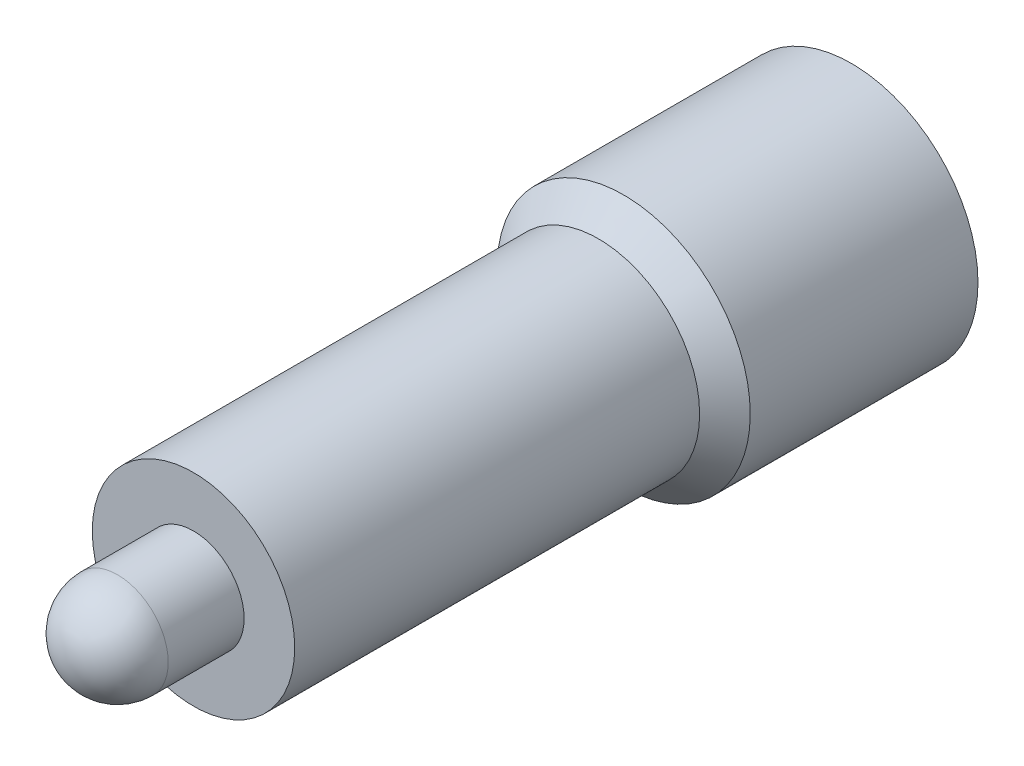
ISO-10303-21;
HEADER;
FILE_DESCRIPTION(('STEP AP214'),'2;1');
FILE_NAME('part.step','',(''),(''),'','','');
FILE_SCHEMA(('AUTOMOTIVE_DESIGN { 1 0 10303 214 1 1 1 1 }'));
ENDSEC;
DATA;
#1=APPLICATION_CONTEXT('core data for automotive mechanical design processes');
#2=APPLICATION_PROTOCOL_DEFINITION('international standard','automotive_design',2000,#1);
#3=PRODUCT_CONTEXT('',#1,'mechanical');
#4=PRODUCT('Part','Part','',(#3));
#5=PRODUCT_RELATED_PRODUCT_CATEGORY('part','',(#4));
#6=PRODUCT_DEFINITION_FORMATION('','',#4);
#7=PRODUCT_DEFINITION_CONTEXT('part definition',#1,'design');
#8=PRODUCT_DEFINITION('design','',#6,#7);
#9=PRODUCT_DEFINITION_SHAPE('','',#8);
#10=(LENGTH_UNIT() NAMED_UNIT(*) SI_UNIT(.MILLI.,.METRE.));
#11=(NAMED_UNIT(*) PLANE_ANGLE_UNIT() SI_UNIT($,.RADIAN.));
#12=(NAMED_UNIT(*) SI_UNIT($,.STERADIAN.) SOLID_ANGLE_UNIT());
#13=UNCERTAINTY_MEASURE_WITH_UNIT(LENGTH_MEASURE(1.E-05),#10,'distance_accuracy_value','');
#14=(GEOMETRIC_REPRESENTATION_CONTEXT(3) GLOBAL_UNCERTAINTY_ASSIGNED_CONTEXT((#13)) GLOBAL_UNIT_ASSIGNED_CONTEXT((#10,
#11,#12)) REPRESENTATION_CONTEXT('',''));
#15=CARTESIAN_POINT('',(0.,0.,0.));
#16=DIRECTION('',(0.,0.,1.));
#17=DIRECTION('',(1.,0.,0.));
#18=AXIS2_PLACEMENT_3D('',#15,#16,#17);
#19=CARTESIAN_POINT('',(0.,0.,10.));
#20=DIRECTION('',(0.,0.,-1.));
#21=DIRECTION('',(-1.,0.,0.));
#22=AXIS2_PLACEMENT_3D('',#19,#20,#21);
#23=CYLINDRICAL_SURFACE('',#22,5.);
#24=CARTESIAN_POINT('',(0.,0.,9.));
#25=DIRECTION('',(0.,0.,1.));
#26=DIRECTION('',(1.,0.,0.));
#27=AXIS2_PLACEMENT_3D('',#24,#25,#26);
#28=CIRCLE('',#27,5.);
#29=CARTESIAN_POINT('',(5.,0.,9.));
#30=VERTEX_POINT('',#29);
#31=EDGE_CURVE('E58',#30,#30,#28,.F.);
#32=ORIENTED_EDGE('',*,*,#31,.T.);
#33=EDGE_LOOP('',(#32));
#34=FACE_BOUND('',#33,.T.);
#35=CARTESIAN_POINT('',(0.,0.,0.));
#36=DIRECTION('',(0.,0.,1.));
#37=DIRECTION('',(1.,0.,0.));
#38=AXIS2_PLACEMENT_3D('',#35,#36,#37);
#39=CIRCLE('',#38,5.);
#40=CARTESIAN_POINT('',(5.,0.,0.));
#41=VERTEX_POINT('',#40);
#42=EDGE_CURVE('E70',#41,#41,#39,.T.);
#43=ORIENTED_EDGE('',*,*,#42,.T.);
#44=EDGE_LOOP('',(#43));
#45=FACE_BOUND('',#44,.T.);
#46=ADVANCED_FACE('F45',(#34,#45),#23,.T.);
#47=CARTESIAN_POINT('',(0.,0.,0.));
#48=DIRECTION('',(0.,0.,1.));
#49=DIRECTION('',(1.,0.,0.));
#50=AXIS2_PLACEMENT_3D('',#47,#48,#49);
#51=PLANE('',#50);
#52=ORIENTED_EDGE('',*,*,#42,.F.);
#53=EDGE_LOOP('',(#52));
#54=FACE_BOUND('',#53,.T.);
#55=ADVANCED_FACE('F82',(#54),#51,.F.);
#56=CARTESIAN_POINT('',(0.,0.,10.));
#57=DIRECTION('',(0.,0.,-1.));
#58=DIRECTION('',(-1.,0.,0.));
#59=AXIS2_PLACEMENT_3D('',#56,#57,#58);
#60=CONICAL_SURFACE('',#59,4.,0.785398163397449);
#61=ORIENTED_EDGE('',*,*,#31,.F.);
#62=EDGE_LOOP('',(#61));
#63=FACE_BOUND('',#62,.T.);
#64=CARTESIAN_POINT('',(0.,0.,10.));
#65=DIRECTION('',(0.,0.,1.));
#66=DIRECTION('',(1.,0.,0.));
#67=AXIS2_PLACEMENT_3D('',#64,#65,#66);
#68=CIRCLE('',#67,4.);
#69=CARTESIAN_POINT('',(4.,0.,10.));
#70=VERTEX_POINT('',#69);
#71=EDGE_CURVE('E64',#70,#70,#68,.T.);
#72=ORIENTED_EDGE('',*,*,#71,.F.);
#73=EDGE_LOOP('',(#72));
#74=FACE_BOUND('',#73,.T.);
#75=ADVANCED_FACE('F80',(#63,#74),#60,.T.);
#76=CARTESIAN_POINT('',(0.,0.,26.));
#77=DIRECTION('',(0.,0.,-1.));
#78=DIRECTION('',(-1.,0.,0.));
#79=AXIS2_PLACEMENT_3D('',#76,#77,#78);
#80=CYLINDRICAL_SURFACE('',#79,4.);
#81=CARTESIAN_POINT('',(0.,0.,26.));
#82=DIRECTION('',(0.,0.,1.));
#83=DIRECTION('',(1.,0.,0.));
#84=AXIS2_PLACEMENT_3D('',#81,#82,#83);
#85=CIRCLE('',#84,4.);
#86=CARTESIAN_POINT('',(4.,0.,26.));
#87=VERTEX_POINT('',#86);
#88=EDGE_CURVE('E66',#87,#87,#85,.T.);
#89=ORIENTED_EDGE('',*,*,#88,.F.);
#90=EDGE_LOOP('',(#89));
#91=FACE_BOUND('',#90,.T.);
#92=ORIENTED_EDGE('',*,*,#71,.T.);
#93=EDGE_LOOP('',(#92));
#94=FACE_BOUND('',#93,.T.);
#95=ADVANCED_FACE('F78',(#91,#94),#80,.T.);
#96=CARTESIAN_POINT('',(0.,0.,26.));
#97=DIRECTION('',(0.,0.,1.));
#98=DIRECTION('',(1.,0.,0.));
#99=AXIS2_PLACEMENT_3D('',#96,#97,#98);
#100=PLANE('',#99);
#101=CARTESIAN_POINT('',(0.,0.,26.));
#102=DIRECTION('',(0.,0.,1.));
#103=DIRECTION('',(1.,0.,0.));
#104=AXIS2_PLACEMENT_3D('',#101,#102,#103);
#105=CIRCLE('',#104,2.);
#106=CARTESIAN_POINT('',(2.,0.,26.));
#107=VERTEX_POINT('',#106);
#108=EDGE_CURVE('E53',#107,#107,#105,.T.);
#109=ORIENTED_EDGE('',*,*,#108,.F.);
#110=EDGE_LOOP('',(#109));
#111=FACE_BOUND('',#110,.T.);
#112=ORIENTED_EDGE('',*,*,#88,.T.);
#113=EDGE_LOOP('',(#112));
#114=FACE_BOUND('',#113,.T.);
#115=ADVANCED_FACE('F88',(#111,#114),#100,.T.);
#116=CARTESIAN_POINT('',(0.,0.,31.));
#117=DIRECTION('',(0.,0.,-1.));
#118=DIRECTION('',(-1.,0.,0.));
#119=AXIS2_PLACEMENT_3D('',#116,#117,#118);
#120=CYLINDRICAL_SURFACE('',#119,2.);
#121=CARTESIAN_POINT('',(0.,0.,29.));
#122=DIRECTION('',(0.,0.,-1.));
#123=DIRECTION('',(-1.,0.,0.));
#124=AXIS2_PLACEMENT_3D('',#121,#122,#123);
#125=CIRCLE('',#124,2.);
#126=CARTESIAN_POINT('',(-2.,0.,29.));
#127=VERTEX_POINT('',#126);
#128=EDGE_CURVE('E10',#127,#127,#125,.T.);
#129=ORIENTED_EDGE('',*,*,#128,.T.);
#130=EDGE_LOOP('',(#129));
#131=FACE_BOUND('',#130,.T.);
#132=ORIENTED_EDGE('',*,*,#108,.T.);
#133=EDGE_LOOP('',(#132));
#134=FACE_BOUND('',#133,.T.);
#135=ADVANCED_FACE('F104',(#131,#134),#120,.T.);
#136=CARTESIAN_POINT('',(0.,0.,29.));
#137=DIRECTION('',(0.,0.,1.));
#138=DIRECTION('',(1.,0.,0.));
#139=AXIS2_PLACEMENT_3D('',#136,#137,#138);
#140=SPHERICAL_SURFACE('',#139,2.);
#141=ORIENTED_EDGE('',*,*,#128,.F.);
#142=EDGE_LOOP('',(#141));
#143=FACE_BOUND('',#142,.T.);
#144=ADVANCED_FACE('F47',(#143),#140,.T.);
#145=CLOSED_SHELL('',(#46,#55,#75,#95,#115,#135,#144));
#146=MANIFOLD_SOLID_BREP('B2',#145);
#147=ADVANCED_BREP_SHAPE_REPRESENTATION('',(#18,#146),#14);
#148=SHAPE_DEFINITION_REPRESENTATION(#9,#147);
ENDSEC;
END-ISO-10303-21;
